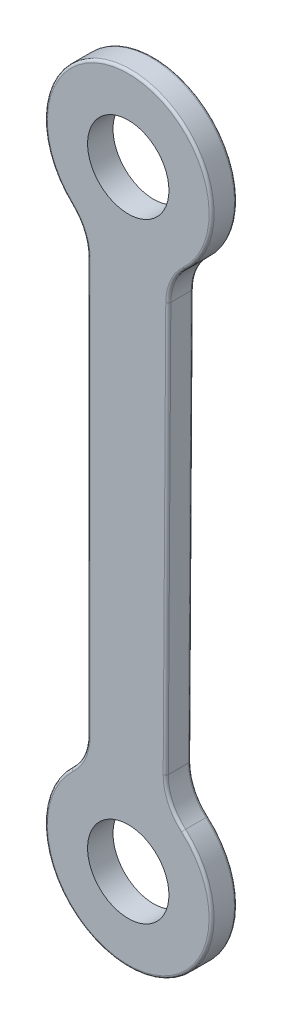
ISO-10303-21;
HEADER;
FILE_DESCRIPTION(('STEP AP214'),'2;1');
FILE_NAME('part.step','',(''),(''),'','','');
FILE_SCHEMA(('AUTOMOTIVE_DESIGN { 1 0 10303 214 1 1 1 1 }'));
ENDSEC;
DATA;
#1=APPLICATION_CONTEXT('core data for automotive mechanical design processes');
#2=APPLICATION_PROTOCOL_DEFINITION('international standard','automotive_design',2000,#1);
#3=PRODUCT_CONTEXT('',#1,'mechanical');
#4=PRODUCT('Part','Part','',(#3));
#5=PRODUCT_RELATED_PRODUCT_CATEGORY('part','',(#4));
#6=PRODUCT_DEFINITION_FORMATION('','',#4);
#7=PRODUCT_DEFINITION_CONTEXT('part definition',#1,'design');
#8=PRODUCT_DEFINITION('design','',#6,#7);
#9=PRODUCT_DEFINITION_SHAPE('','',#8);
#10=(LENGTH_UNIT() NAMED_UNIT(*) SI_UNIT(.MILLI.,.METRE.));
#11=(NAMED_UNIT(*) PLANE_ANGLE_UNIT() SI_UNIT($,.RADIAN.));
#12=(NAMED_UNIT(*) SI_UNIT($,.STERADIAN.) SOLID_ANGLE_UNIT());
#13=UNCERTAINTY_MEASURE_WITH_UNIT(LENGTH_MEASURE(1.E-05),#10,'distance_accuracy_value','');
#14=(GEOMETRIC_REPRESENTATION_CONTEXT(3) GLOBAL_UNCERTAINTY_ASSIGNED_CONTEXT((#13)) GLOBAL_UNIT_ASSIGNED_CONTEXT((#10,
#11,#12)) REPRESENTATION_CONTEXT('',''));
#15=CARTESIAN_POINT('',(0.,0.,0.));
#16=DIRECTION('',(0.,0.,1.));
#17=DIRECTION('',(1.,0.,0.));
#18=AXIS2_PLACEMENT_3D('',#15,#16,#17);
#19=CARTESIAN_POINT('',(-18.,100.694497558709,5.));
#20=DIRECTION('',(0.,0.,1.));
#21=DIRECTION('',(1.,0.,0.));
#22=AXIS2_PLACEMENT_3D('',#19,#20,#21);
#23=PLANE('',#22);
#24=CARTESIAN_POINT('',(17.3653896066539,19.8782712608472,5.));
#25=DIRECTION('',(0.,0.,1.));
#26=DIRECTION('',(1.,0.,0.));
#27=AXIS2_PLACEMENT_3D('',#24,#25,#26);
#28=CIRCLE('',#27,10.5);
#29=CARTESIAN_POINT('',(10.4574239522485,11.9706793064306,5.));
#30=VERTEX_POINT('',#29);
#31=CARTESIAN_POINT('',(6.8656007605948,19.9448609610506,5.));
#32=VERTEX_POINT('',#31);
#33=EDGE_CURVE('E62',#30,#32,#28,.F.);
#34=ORIENTED_EDGE('',*,*,#33,.T.);
#35=DIRECTION('',(0.00634187620984643,0.999979890100866,0.));
#36=VECTOR('',#35,1.);
#37=CARTESIAN_POINT('',(7.37741606910492,100.647321718842,5.));
#38=LINE('',#37,#36);
#39=CARTESIAN_POINT('',(7.37741606910493,100.647321718842,5.));
#40=VERTEX_POINT('',#39);
#41=EDGE_CURVE('E164',#32,#40,#38,.T.);
#42=ORIENTED_EDGE('',*,*,#41,.T.);
#43=CARTESIAN_POINT('',(17.877204915164,100.580732018638,5.));
#44=DIRECTION('',(0.,0.,1.));
#45=DIRECTION('',(1.,0.,0.));
#46=AXIS2_PLACEMENT_3D('',#43,#44,#45);
#47=CIRCLE('',#46,10.5);
#48=CARTESIAN_POINT('',(10.7656387281663,108.305732107179,5.));
#49=VERTEX_POINT('',#48);
#50=EDGE_CURVE('E279',#40,#49,#47,.F.);
#51=ORIENTED_EDGE('',*,*,#50,.T.);
#52=CARTESIAN_POINT('',(0.,120.,5.));
#53=DIRECTION('',(0.,0.,1.));
#54=DIRECTION('',(1.,0.,0.));
#55=AXIS2_PLACEMENT_3D('',#52,#53,#54);
#56=CIRCLE('',#55,15.8951212255354);
#57=CARTESIAN_POINT('',(-10.8395858315984,108.37424162586,5.));
#58=VERTEX_POINT('',#57);
#59=EDGE_CURVE('E276',#49,#58,#56,.T.);
#60=ORIENTED_EDGE('',*,*,#59,.T.);
#61=CARTESIAN_POINT('',(-18.,100.694497558709,5.));
#62=DIRECTION('',(0.,0.,1.));
#63=DIRECTION('',(1.,0.,0.));
#64=AXIS2_PLACEMENT_3D('',#61,#62,#63);
#65=CIRCLE('',#64,10.5);
#66=CARTESIAN_POINT('',(-7.5,100.694497558709,5.));
#67=VERTEX_POINT('',#66);
#68=EDGE_CURVE('E282',#58,#67,#65,.F.);
#69=ORIENTED_EDGE('',*,*,#68,.T.);
#70=DIRECTION('',(0.,-1.,0.));
#71=VECTOR('',#70,1.);
#72=CARTESIAN_POINT('',(-7.5,19.3055024412914,5.));
#73=LINE('',#72,#71);
#74=CARTESIAN_POINT('',(-7.5,19.3055024412914,5.));
#75=VERTEX_POINT('',#74);
#76=EDGE_CURVE('E285',#67,#75,#73,.T.);
#77=ORIENTED_EDGE('',*,*,#76,.T.);
#78=CARTESIAN_POINT('',(-18.,19.3055024412914,5.));
#79=DIRECTION('',(0.,0.,1.));
#80=DIRECTION('',(1.,0.,0.));
#81=AXIS2_PLACEMENT_3D('',#78,#79,#80);
#82=CIRCLE('',#81,10.5);
#83=CARTESIAN_POINT('',(-10.8395858315984,11.6257583741395,5.));
#84=VERTEX_POINT('',#83);
#85=EDGE_CURVE('E288',#75,#84,#82,.F.);
#86=ORIENTED_EDGE('',*,*,#85,.T.);
#87=CARTESIAN_POINT('',(0.,0.,5.));
#88=DIRECTION('',(0.,0.,1.));
#89=DIRECTION('',(1.,0.,0.));
#90=AXIS2_PLACEMENT_3D('',#87,#88,#89);
#91=CIRCLE('',#90,15.8951212255354);
#92=EDGE_CURVE('E67',#84,#30,#91,.T.);
#93=ORIENTED_EDGE('',*,*,#92,.T.);
#94=EDGE_LOOP('',(#34,#42,#51,#60,#69,#77,#86,#93));
#95=FACE_BOUND('',#94,.T.);
#96=CARTESIAN_POINT('',(0.,120.,5.));
#97=DIRECTION('',(0.,0.,1.));
#98=DIRECTION('',(1.,0.,0.));
#99=AXIS2_PLACEMENT_3D('',#96,#97,#98);
#100=CIRCLE('',#99,8.00000000000001);
#101=CARTESIAN_POINT('',(8.00000000000001,120.,5.));
#102=VERTEX_POINT('',#101);
#103=EDGE_CURVE('E663',#102,#102,#100,.T.);
#104=ORIENTED_EDGE('',*,*,#103,.F.);
#105=EDGE_LOOP('',(#104));
#106=FACE_BOUND('',#105,.T.);
#107=CARTESIAN_POINT('',(0.,0.,5.));
#108=DIRECTION('',(0.,0.,1.));
#109=DIRECTION('',(1.,0.,0.));
#110=AXIS2_PLACEMENT_3D('',#107,#108,#109);
#111=CIRCLE('',#110,8.);
#112=CARTESIAN_POINT('',(8.,0.,5.));
#113=VERTEX_POINT('',#112);
#114=EDGE_CURVE('E668',#113,#113,#111,.T.);
#115=ORIENTED_EDGE('',*,*,#114,.F.);
#116=EDGE_LOOP('',(#115));
#117=FACE_BOUND('',#116,.T.);
#118=ADVANCED_FACE('F44',(#95,#106,#117),#23,.T.);
#119=CARTESIAN_POINT('',(-18.,100.694497558709,0.));
#120=DIRECTION('',(0.,0.,1.));
#121=DIRECTION('',(1.,0.,0.));
#122=AXIS2_PLACEMENT_3D('',#119,#120,#121);
#123=PLANE('',#122);
#124=DIRECTION('',(0.00634187620984643,0.999979890100866,0.));
#125=VECTOR('',#124,1.);
#126=CARTESIAN_POINT('',(7.37669458213285,100.533558466585,0.));
#127=LINE('',#126,#125);
#128=CARTESIAN_POINT('',(7.37741606910493,100.647321718842,0.));
#129=VERTEX_POINT('',#128);
#130=CARTESIAN_POINT('',(6.8656007605948,19.9448609610506,0.));
#131=VERTEX_POINT('',#130);
#132=EDGE_CURVE('E215',#129,#131,#127,.F.);
#133=ORIENTED_EDGE('',*,*,#132,.T.);
#134=CARTESIAN_POINT('',(17.3653896066539,19.8782712608472,0.));
#135=DIRECTION('',(0.,0.,1.));
#136=DIRECTION('',(1.,0.,0.));
#137=AXIS2_PLACEMENT_3D('',#134,#135,#136);
#138=CIRCLE('',#137,10.5);
#139=CARTESIAN_POINT('',(10.4574239522485,11.9706793064306,0.));
#140=VERTEX_POINT('',#139);
#141=EDGE_CURVE('E236',#131,#140,#138,.T.);
#142=ORIENTED_EDGE('',*,*,#141,.T.);
#143=CARTESIAN_POINT('',(0.,0.,0.));
#144=DIRECTION('',(0.,0.,1.));
#145=DIRECTION('',(1.,0.,0.));
#146=AXIS2_PLACEMENT_3D('',#143,#144,#145);
#147=CIRCLE('',#146,15.8951212255354);
#148=CARTESIAN_POINT('',(-10.8395858315984,11.6257583741395,0.));
#149=VERTEX_POINT('',#148);
#150=EDGE_CURVE('E233',#140,#149,#147,.F.);
#151=ORIENTED_EDGE('',*,*,#150,.T.);
#152=CARTESIAN_POINT('',(-18.,19.3055024412914,0.));
#153=DIRECTION('',(0.,0.,1.));
#154=DIRECTION('',(1.,0.,0.));
#155=AXIS2_PLACEMENT_3D('',#152,#153,#154);
#156=CIRCLE('',#155,10.5);
#157=CARTESIAN_POINT('',(-7.5,19.3055024412914,0.));
#158=VERTEX_POINT('',#157);
#159=EDGE_CURVE('E230',#149,#158,#156,.T.);
#160=ORIENTED_EDGE('',*,*,#159,.T.);
#161=DIRECTION('',(0.,-1.,0.));
#162=VECTOR('',#161,1.);
#163=CARTESIAN_POINT('',(-7.5,100.694497558709,0.));
#164=LINE('',#163,#162);
#165=CARTESIAN_POINT('',(-7.5,100.694497558709,0.));
#166=VERTEX_POINT('',#165);
#167=EDGE_CURVE('E227',#158,#166,#164,.F.);
#168=ORIENTED_EDGE('',*,*,#167,.T.);
#169=CARTESIAN_POINT('',(-18.,100.694497558709,0.));
#170=DIRECTION('',(0.,0.,1.));
#171=DIRECTION('',(1.,0.,0.));
#172=AXIS2_PLACEMENT_3D('',#169,#170,#171);
#173=CIRCLE('',#172,10.5);
#174=CARTESIAN_POINT('',(-10.8395858315984,108.37424162586,0.));
#175=VERTEX_POINT('',#174);
#176=EDGE_CURVE('E224',#166,#175,#173,.T.);
#177=ORIENTED_EDGE('',*,*,#176,.T.);
#178=CARTESIAN_POINT('',(0.,120.,0.));
#179=DIRECTION('',(0.,0.,1.));
#180=DIRECTION('',(1.,0.,0.));
#181=AXIS2_PLACEMENT_3D('',#178,#179,#180);
#182=CIRCLE('',#181,15.8951212255354);
#183=CARTESIAN_POINT('',(10.7656387281663,108.305732107179,0.));
#184=VERTEX_POINT('',#183);
#185=EDGE_CURVE('E221',#175,#184,#182,.F.);
#186=ORIENTED_EDGE('',*,*,#185,.T.);
#187=CARTESIAN_POINT('',(17.877204915164,100.580732018638,0.));
#188=DIRECTION('',(0.,0.,1.));
#189=DIRECTION('',(1.,0.,0.));
#190=AXIS2_PLACEMENT_3D('',#187,#188,#189);
#191=CIRCLE('',#190,10.5);
#192=EDGE_CURVE('E218',#184,#129,#191,.T.);
#193=ORIENTED_EDGE('',*,*,#192,.T.);
#194=EDGE_LOOP('',(#133,#142,#151,#160,#168,#177,#186,#193));
#195=FACE_BOUND('',#194,.T.);
#196=CARTESIAN_POINT('',(0.,120.,0.));
#197=DIRECTION('',(0.,0.,1.));
#198=DIRECTION('',(1.,0.,0.));
#199=AXIS2_PLACEMENT_3D('',#196,#197,#198);
#200=CIRCLE('',#199,8.00000000000001);
#201=CARTESIAN_POINT('',(8.00000000000001,120.,0.));
#202=VERTEX_POINT('',#201);
#203=EDGE_CURVE('E666',#202,#202,#200,.T.);
#204=ORIENTED_EDGE('',*,*,#203,.T.);
#205=EDGE_LOOP('',(#204));
#206=FACE_BOUND('',#205,.T.);
#207=CARTESIAN_POINT('',(0.,0.,0.));
#208=DIRECTION('',(0.,0.,1.));
#209=DIRECTION('',(1.,0.,0.));
#210=AXIS2_PLACEMENT_3D('',#207,#208,#209);
#211=CIRCLE('',#210,8.);
#212=CARTESIAN_POINT('',(8.,0.,0.));
#213=VERTEX_POINT('',#212);
#214=EDGE_CURVE('E329',#213,#213,#211,.T.);
#215=ORIENTED_EDGE('',*,*,#214,.T.);
#216=EDGE_LOOP('',(#215));
#217=FACE_BOUND('',#216,.T.);
#218=ADVANCED_FACE('F385',(#195,#206,#217),#123,.F.);
#219=CARTESIAN_POINT('',(-18.,100.694497558709,5.));
#220=DIRECTION('',(0.,0.,-1.));
#221=DIRECTION('',(-1.,0.,0.));
#222=AXIS2_PLACEMENT_3D('',#219,#220,#221);
#223=CYLINDRICAL_SURFACE('',#222,10.);
#224=DIRECTION('',(0.,0.,-1.));
#225=VECTOR('',#224,1.);
#226=CARTESIAN_POINT('',(-11.1805579348557,108.008539527425,5.));
#227=LINE('',#226,#225);
#228=CARTESIAN_POINT('',(-11.1805579348557,108.008539527425,4.5));
#229=VERTEX_POINT('',#228);
#230=CARTESIAN_POINT('',(-11.1805579348557,108.008539527425,0.5));
#231=VERTEX_POINT('',#230);
#232=EDGE_CURVE('E372',#229,#231,#227,.T.);
#233=ORIENTED_EDGE('',*,*,#232,.T.);
#234=CARTESIAN_POINT('',(-18.,100.694497558709,0.5));
#235=DIRECTION('',(0.,0.,1.));
#236=DIRECTION('',(1.,0.,0.));
#237=AXIS2_PLACEMENT_3D('',#234,#235,#236);
#238=CIRCLE('',#237,10.);
#239=CARTESIAN_POINT('',(-8.,100.694497558709,0.5));
#240=VERTEX_POINT('',#239);
#241=EDGE_CURVE('E261',#231,#240,#238,.F.);
#242=ORIENTED_EDGE('',*,*,#241,.T.);
#243=DIRECTION('',(0.,0.,-1.));
#244=VECTOR('',#243,1.);
#245=CARTESIAN_POINT('',(-8.,100.694497558709,5.));
#246=LINE('',#245,#244);
#247=CARTESIAN_POINT('',(-8.,100.694497558709,4.5));
#248=VERTEX_POINT('',#247);
#249=EDGE_CURVE('E180',#248,#240,#246,.T.);
#250=ORIENTED_EDGE('',*,*,#249,.F.);
#251=CARTESIAN_POINT('',(-18.,100.694497558709,4.5));
#252=DIRECTION('',(0.,0.,1.));
#253=DIRECTION('',(1.,0.,0.));
#254=AXIS2_PLACEMENT_3D('',#251,#252,#253);
#255=CIRCLE('',#254,10.);
#256=EDGE_CURVE('E258',#248,#229,#255,.T.);
#257=ORIENTED_EDGE('',*,*,#256,.T.);
#258=EDGE_LOOP('',(#233,#242,#250,#257));
#259=FACE_BOUND('',#258,.T.);
#260=ADVANCED_FACE('F369',(#259),#223,.F.);
#261=CARTESIAN_POINT('',(-8.,19.3055024412914,5.));
#262=DIRECTION('',(1.,0.,0.));
#263=DIRECTION('',(0.,0.,-1.));
#264=AXIS2_PLACEMENT_3D('',#261,#262,#263);
#265=PLANE('',#264);
#266=ORIENTED_EDGE('',*,*,#249,.T.);
#267=DIRECTION('',(0.,-1.,0.));
#268=VECTOR('',#267,1.);
#269=CARTESIAN_POINT('',(-8.,19.3055024412914,0.5));
#270=LINE('',#269,#268);
#271=CARTESIAN_POINT('',(-8.,19.3055024412914,0.5));
#272=VERTEX_POINT('',#271);
#273=EDGE_CURVE('E255',#240,#272,#270,.T.);
#274=ORIENTED_EDGE('',*,*,#273,.T.);
#275=DIRECTION('',(0.,0.,-1.));
#276=VECTOR('',#275,1.);
#277=CARTESIAN_POINT('',(-8.,19.3055024412914,5.));
#278=LINE('',#277,#276);
#279=CARTESIAN_POINT('',(-8.,19.3055024412914,4.5));
#280=VERTEX_POINT('',#279);
#281=EDGE_CURVE('E206',#280,#272,#278,.T.);
#282=ORIENTED_EDGE('',*,*,#281,.F.);
#283=DIRECTION('',(0.,-1.,0.));
#284=VECTOR('',#283,1.);
#285=CARTESIAN_POINT('',(-8.,100.694497558709,4.5));
#286=LINE('',#285,#284);
#287=EDGE_CURVE('E252',#280,#248,#286,.F.);
#288=ORIENTED_EDGE('',*,*,#287,.T.);
#289=EDGE_LOOP('',(#266,#274,#282,#288));
#290=FACE_BOUND('',#289,.T.);
#291=ADVANCED_FACE('F365',(#290),#265,.F.);
#292=CARTESIAN_POINT('',(-18.,19.3055024412914,5.));
#293=DIRECTION('',(0.,0.,-1.));
#294=DIRECTION('',(-1.,0.,0.));
#295=AXIS2_PLACEMENT_3D('',#292,#293,#294);
#296=CYLINDRICAL_SURFACE('',#295,10.);
#297=ORIENTED_EDGE('',*,*,#281,.T.);
#298=CARTESIAN_POINT('',(-18.,19.3055024412914,0.5));
#299=DIRECTION('',(0.,0.,1.));
#300=DIRECTION('',(1.,0.,0.));
#301=AXIS2_PLACEMENT_3D('',#298,#299,#300);
#302=CIRCLE('',#301,10.);
#303=CARTESIAN_POINT('',(-11.1805579348557,11.9914604725753,0.5));
#304=VERTEX_POINT('',#303);
#305=EDGE_CURVE('E249',#272,#304,#302,.F.);
#306=ORIENTED_EDGE('',*,*,#305,.T.);
#307=DIRECTION('',(0.,0.,-1.));
#308=VECTOR('',#307,1.);
#309=CARTESIAN_POINT('',(-11.1805579348557,11.9914604725753,5.));
#310=LINE('',#309,#308);
#311=CARTESIAN_POINT('',(-11.1805579348557,11.9914604725753,4.5));
#312=VERTEX_POINT('',#311);
#313=EDGE_CURVE('E197',#312,#304,#310,.T.);
#314=ORIENTED_EDGE('',*,*,#313,.F.);
#315=CARTESIAN_POINT('',(-18.,19.3055024412914,4.5));
#316=DIRECTION('',(0.,0.,1.));
#317=DIRECTION('',(1.,0.,0.));
#318=AXIS2_PLACEMENT_3D('',#315,#316,#317);
#319=CIRCLE('',#318,10.);
#320=EDGE_CURVE('E246',#312,#280,#319,.T.);
#321=ORIENTED_EDGE('',*,*,#320,.T.);
#322=EDGE_LOOP('',(#297,#306,#314,#321));
#323=FACE_BOUND('',#322,.T.);
#324=ADVANCED_FACE('F394',(#323),#296,.F.);
#325=CARTESIAN_POINT('',(0.,0.,5.));
#326=DIRECTION('',(0.,0.,-1.));
#327=DIRECTION('',(-1.,0.,0.));
#328=AXIS2_PLACEMENT_3D('',#325,#326,#327);
#329=CYLINDRICAL_SURFACE('',#328,16.3951212255354);
#330=ORIENTED_EDGE('',*,*,#313,.T.);
#331=CARTESIAN_POINT('',(0.,0.,0.5));
#332=DIRECTION('',(0.,0.,1.));
#333=DIRECTION('',(1.,0.,0.));
#334=AXIS2_PLACEMENT_3D('',#331,#332,#333);
#335=CIRCLE('',#334,16.3951212255354);
#336=CARTESIAN_POINT('',(10.7863746976963,12.3472313042599,0.5));
#337=VERTEX_POINT('',#336);
#338=EDGE_CURVE('E243',#304,#337,#335,.T.);
#339=ORIENTED_EDGE('',*,*,#338,.T.);
#340=DIRECTION('',(0.,0.,-1.));
#341=VECTOR('',#340,1.);
#342=CARTESIAN_POINT('',(10.7863746976963,12.3472313042599,5.));
#343=LINE('',#342,#341);
#344=CARTESIAN_POINT('',(10.7863746976963,12.3472313042599,4.5));
#345=VERTEX_POINT('',#344);
#346=EDGE_CURVE('E193',#345,#337,#343,.T.);
#347=ORIENTED_EDGE('',*,*,#346,.F.);
#348=CARTESIAN_POINT('',(0.,0.,4.5));
#349=DIRECTION('',(0.,0.,1.));
#350=DIRECTION('',(1.,0.,0.));
#351=AXIS2_PLACEMENT_3D('',#348,#349,#350);
#352=CIRCLE('',#351,16.3951212255354);
#353=EDGE_CURVE('E240',#345,#312,#352,.F.);
#354=ORIENTED_EDGE('',*,*,#353,.T.);
#355=EDGE_LOOP('',(#330,#339,#347,#354));
#356=FACE_BOUND('',#355,.T.);
#357=ADVANCED_FACE('F398',(#356),#329,.T.);
#358=CARTESIAN_POINT('',(17.3653896066539,19.8782712608472,5.));
#359=DIRECTION('',(0.,0.,-1.));
#360=DIRECTION('',(-1.,0.,0.));
#361=AXIS2_PLACEMENT_3D('',#358,#359,#360);
#362=CYLINDRICAL_SURFACE('',#361,10.);
#363=ORIENTED_EDGE('',*,*,#346,.T.);
#364=CARTESIAN_POINT('',(17.3653896066539,19.8782712608472,0.5));
#365=DIRECTION('',(0.,0.,1.));
#366=DIRECTION('',(1.,0.,0.));
#367=AXIS2_PLACEMENT_3D('',#364,#365,#366);
#368=CIRCLE('',#367,10.);
#369=CARTESIAN_POINT('',(7.36559070564523,19.9416900229457,0.5));
#370=VERTEX_POINT('',#369);
#371=EDGE_CURVE('E179',#337,#370,#368,.F.);
#372=ORIENTED_EDGE('',*,*,#371,.T.);
#373=DIRECTION('',(0.,0.,-1.));
#374=VECTOR('',#373,1.);
#375=CARTESIAN_POINT('',(7.36559070564523,19.9416900229457,5.));
#376=LINE('',#375,#374);
#377=CARTESIAN_POINT('',(7.36559070564523,19.9416900229457,4.5));
#378=VERTEX_POINT('',#377);
#379=EDGE_CURVE('E186',#378,#370,#376,.T.);
#380=ORIENTED_EDGE('',*,*,#379,.F.);
#381=CARTESIAN_POINT('',(17.3653896066539,19.8782712608472,4.5));
#382=DIRECTION('',(0.,0.,1.));
#383=DIRECTION('',(1.,0.,0.));
#384=AXIS2_PLACEMENT_3D('',#381,#382,#383);
#385=CIRCLE('',#384,10.);
#386=EDGE_CURVE('E171',#378,#345,#385,.T.);
#387=ORIENTED_EDGE('',*,*,#386,.T.);
#388=EDGE_LOOP('',(#363,#372,#380,#387));
#389=FACE_BOUND('',#388,.T.);
#390=ADVANCED_FACE('F190',(#389),#362,.F.);
#391=CARTESIAN_POINT('',(7.36559070564523,19.9416900229457,5.));
#392=DIRECTION('',(-0.999979890100866,0.00634187620984643,0.));
#393=DIRECTION('',(-0.00634187620984643,-0.999979890100866,0.));
#394=AXIS2_PLACEMENT_3D('',#391,#392,#393);
#395=PLANE('',#394);
#396=DIRECTION('',(0.,0.,-1.));
#397=VECTOR('',#396,1.);
#398=CARTESIAN_POINT('',(7.87740601415536,100.644150780737,5.));
#399=LINE('',#398,#397);
#400=CARTESIAN_POINT('',(7.87740601415536,100.644150780737,4.5));
#401=VERTEX_POINT('',#400);
#402=CARTESIAN_POINT('',(7.87740601415536,100.644150780737,0.5));
#403=VERTEX_POINT('',#402);
#404=EDGE_CURVE('E188',#401,#403,#399,.T.);
#405=ORIENTED_EDGE('',*,*,#404,.F.);
#406=DIRECTION('',(0.00634187620984643,0.999979890100866,0.));
#407=VECTOR('',#406,1.);
#408=CARTESIAN_POINT('',(7.36559070564523,19.9416900229457,4.5));
#409=LINE('',#408,#407);
#410=EDGE_CURVE('E11',#401,#378,#409,.F.);
#411=ORIENTED_EDGE('',*,*,#410,.T.);
#412=ORIENTED_EDGE('',*,*,#379,.T.);
#413=DIRECTION('',(0.00634187620984643,0.999979890100866,0.));
#414=VECTOR('',#413,1.);
#415=CARTESIAN_POINT('',(7.36559070564523,19.9416900229457,0.5));
#416=LINE('',#415,#414);
#417=EDGE_CURVE('E54',#370,#403,#416,.T.);
#418=ORIENTED_EDGE('',*,*,#417,.T.);
#419=EDGE_LOOP('',(#405,#411,#412,#418));
#420=FACE_BOUND('',#419,.T.);
#421=ADVANCED_FACE('F185',(#420),#395,.F.);
#422=CARTESIAN_POINT('',(17.877204915164,100.580732018638,5.));
#423=DIRECTION('',(0.,0.,-1.));
#424=DIRECTION('',(-1.,0.,0.));
#425=AXIS2_PLACEMENT_3D('',#422,#423,#424);
#426=CYLINDRICAL_SURFACE('',#425,10.);
#427=ORIENTED_EDGE('',*,*,#404,.T.);
#428=CARTESIAN_POINT('',(17.877204915164,100.580732018638,0.5));
#429=DIRECTION('',(0.,0.,1.));
#430=DIRECTION('',(1.,0.,0.));
#431=AXIS2_PLACEMENT_3D('',#428,#429,#430);
#432=CIRCLE('',#431,10.);
#433=CARTESIAN_POINT('',(11.104284737071,107.937874960105,0.5));
#434=VERTEX_POINT('',#433);
#435=EDGE_CURVE('E273',#403,#434,#432,.F.);
#436=ORIENTED_EDGE('',*,*,#435,.T.);
#437=DIRECTION('',(0.,0.,-1.));
#438=VECTOR('',#437,1.);
#439=CARTESIAN_POINT('',(11.104284737071,107.937874960105,5.));
#440=LINE('',#439,#438);
#441=CARTESIAN_POINT('',(11.104284737071,107.937874960105,4.5));
#442=VERTEX_POINT('',#441);
#443=EDGE_CURVE('E199',#442,#434,#440,.T.);
#444=ORIENTED_EDGE('',*,*,#443,.F.);
#445=CARTESIAN_POINT('',(17.877204915164,100.580732018638,4.5));
#446=DIRECTION('',(0.,0.,1.));
#447=DIRECTION('',(1.,0.,0.));
#448=AXIS2_PLACEMENT_3D('',#445,#446,#447);
#449=CIRCLE('',#448,10.);
#450=EDGE_CURVE('E270',#442,#401,#449,.T.);
#451=ORIENTED_EDGE('',*,*,#450,.T.);
#452=EDGE_LOOP('',(#427,#436,#444,#451));
#453=FACE_BOUND('',#452,.T.);
#454=ADVANCED_FACE('F418',(#453),#426,.F.);
#455=CARTESIAN_POINT('',(0.,120.,5.));
#456=DIRECTION('',(0.,0.,-1.));
#457=DIRECTION('',(-1.,0.,0.));
#458=AXIS2_PLACEMENT_3D('',#455,#456,#457);
#459=CYLINDRICAL_SURFACE('',#458,16.3951212255354);
#460=ORIENTED_EDGE('',*,*,#443,.T.);
#461=CARTESIAN_POINT('',(0.,120.,0.5));
#462=DIRECTION('',(0.,0.,1.));
#463=DIRECTION('',(1.,0.,0.));
#464=AXIS2_PLACEMENT_3D('',#461,#462,#463);
#465=CIRCLE('',#464,16.3951212255354);
#466=EDGE_CURVE('E267',#434,#231,#465,.T.);
#467=ORIENTED_EDGE('',*,*,#466,.T.);
#468=ORIENTED_EDGE('',*,*,#232,.F.);
#469=CARTESIAN_POINT('',(0.,120.,4.5));
#470=DIRECTION('',(0.,0.,1.));
#471=DIRECTION('',(1.,0.,0.));
#472=AXIS2_PLACEMENT_3D('',#469,#470,#471);
#473=CIRCLE('',#472,16.3951212255354);
#474=EDGE_CURVE('E264',#229,#442,#473,.F.);
#475=ORIENTED_EDGE('',*,*,#474,.T.);
#476=EDGE_LOOP('',(#460,#467,#468,#475));
#477=FACE_BOUND('',#476,.T.);
#478=ADVANCED_FACE('F444',(#477),#459,.T.);
#479=CARTESIAN_POINT('',(0.,120.,5.));
#480=DIRECTION('',(0.,0.,-1.));
#481=DIRECTION('',(-1.,0.,0.));
#482=AXIS2_PLACEMENT_3D('',#479,#480,#481);
#483=CYLINDRICAL_SURFACE('',#482,8.00000000000001);
#484=ORIENTED_EDGE('',*,*,#103,.T.);
#485=EDGE_LOOP('',(#484));
#486=FACE_BOUND('',#485,.T.);
#487=ORIENTED_EDGE('',*,*,#203,.F.);
#488=EDGE_LOOP('',(#487));
#489=FACE_BOUND('',#488,.T.);
#490=ADVANCED_FACE('F441',(#486,#489),#483,.F.);
#491=CARTESIAN_POINT('',(0.,0.,5.));
#492=DIRECTION('',(0.,0.,-1.));
#493=DIRECTION('',(-1.,0.,0.));
#494=AXIS2_PLACEMENT_3D('',#491,#492,#493);
#495=CYLINDRICAL_SURFACE('',#494,8.);
#496=ORIENTED_EDGE('',*,*,#114,.T.);
#497=EDGE_LOOP('',(#496));
#498=FACE_BOUND('',#497,.T.);
#499=ORIENTED_EDGE('',*,*,#214,.F.);
#500=EDGE_LOOP('',(#499));
#501=FACE_BOUND('',#500,.T.);
#502=ADVANCED_FACE('F580',(#498,#501),#495,.F.);
#503=CARTESIAN_POINT('',(-18.,100.694497558709,0.5));
#504=DIRECTION('',(0.,0.,1.));
#505=DIRECTION('',(1.,0.,0.));
#506=AXIS2_PLACEMENT_3D('',#503,#504,#505);
#507=TOROIDAL_SURFACE('',#506,10.5,0.5);
#508=CARTESIAN_POINT('',(-10.8395858315984,108.37424162586,0.5));
#509=DIRECTION('',(-0.7314041968716,0.681944206514441,0.));
#510=DIRECTION('',(-0.681944206514441,-0.7314041968716,0.));
#511=AXIS2_PLACEMENT_3D('',#508,#509,#510);
#512=CIRCLE('',#511,0.5);
#513=EDGE_CURVE('E321',#175,#231,#512,.T.);
#514=ORIENTED_EDGE('',*,*,#513,.F.);
#515=ORIENTED_EDGE('',*,*,#176,.F.);
#516=CARTESIAN_POINT('',(-7.5,100.694497558709,0.5));
#517=DIRECTION('',(0.,-1.,0.));
#518=DIRECTION('',(0.,0.,-1.));
#519=AXIS2_PLACEMENT_3D('',#516,#517,#518);
#520=CIRCLE('',#519,0.5);
#521=EDGE_CURVE('E325',#240,#166,#520,.T.);
#522=ORIENTED_EDGE('',*,*,#521,.F.);
#523=ORIENTED_EDGE('',*,*,#241,.F.);
#524=EDGE_LOOP('',(#514,#515,#522,#523));
#525=FACE_BOUND('',#524,.T.);
#526=ADVANCED_FACE('F375',(#525),#507,.T.);
#527=CARTESIAN_POINT('',(-7.5,19.3055024412914,0.5));
#528=DIRECTION('',(0.,-1.,0.));
#529=DIRECTION('',(0.,0.,-1.));
#530=AXIS2_PLACEMENT_3D('',#527,#528,#529);
#531=CYLINDRICAL_SURFACE('',#530,0.5);
#532=ORIENTED_EDGE('',*,*,#521,.T.);
#533=ORIENTED_EDGE('',*,*,#167,.F.);
#534=CARTESIAN_POINT('',(-7.5,19.3055024412914,0.5));
#535=DIRECTION('',(0.,-1.,0.));
#536=DIRECTION('',(0.,0.,-1.));
#537=AXIS2_PLACEMENT_3D('',#534,#535,#536);
#538=CIRCLE('',#537,0.5);
#539=EDGE_CURVE('E317',#272,#158,#538,.T.);
#540=ORIENTED_EDGE('',*,*,#539,.F.);
#541=ORIENTED_EDGE('',*,*,#273,.F.);
#542=EDGE_LOOP('',(#532,#533,#540,#541));
#543=FACE_BOUND('',#542,.T.);
#544=ADVANCED_FACE('F390',(#543),#531,.T.);
#545=CARTESIAN_POINT('',(0.,120.,0.5));
#546=DIRECTION('',(0.,0.,1.));
#547=DIRECTION('',(1.,0.,0.));
#548=AXIS2_PLACEMENT_3D('',#545,#546,#547);
#549=TOROIDAL_SURFACE('',#548,15.8951212255354,0.5);
#550=ORIENTED_EDGE('',*,*,#513,.T.);
#551=ORIENTED_EDGE('',*,*,#466,.F.);
#552=CARTESIAN_POINT('',(10.7656387281663,108.305732107179,0.5));
#553=DIRECTION('',(-0.735714294146713,-0.677292017809309,0.));
#554=DIRECTION('',(0.677292017809309,-0.735714294146713,0.));
#555=AXIS2_PLACEMENT_3D('',#552,#553,#554);
#556=CIRCLE('',#555,0.5);
#557=EDGE_CURVE('E313',#184,#434,#556,.T.);
#558=ORIENTED_EDGE('',*,*,#557,.F.);
#559=ORIENTED_EDGE('',*,*,#185,.F.);
#560=EDGE_LOOP('',(#550,#551,#558,#559));
#561=FACE_BOUND('',#560,.T.);
#562=ADVANCED_FACE('F381',(#561),#549,.T.);
#563=CARTESIAN_POINT('',(-18.,19.3055024412914,0.5));
#564=DIRECTION('',(0.,0.,1.));
#565=DIRECTION('',(1.,0.,0.));
#566=AXIS2_PLACEMENT_3D('',#563,#564,#565);
#567=TOROIDAL_SURFACE('',#566,10.5,0.5);
#568=ORIENTED_EDGE('',*,*,#539,.T.);
#569=ORIENTED_EDGE('',*,*,#159,.F.);
#570=CARTESIAN_POINT('',(-10.8395858315984,11.6257583741395,0.5));
#571=DIRECTION('',(-0.731404196871607,-0.681944206514434,0.));
#572=DIRECTION('',(0.681944206514434,-0.731404196871607,0.));
#573=AXIS2_PLACEMENT_3D('',#570,#571,#572);
#574=CIRCLE('',#573,0.5);
#575=EDGE_CURVE('E309',#304,#149,#574,.T.);
#576=ORIENTED_EDGE('',*,*,#575,.F.);
#577=ORIENTED_EDGE('',*,*,#305,.F.);
#578=EDGE_LOOP('',(#568,#569,#576,#577));
#579=FACE_BOUND('',#578,.T.);
#580=ADVANCED_FACE('F403',(#579),#567,.T.);
#581=CARTESIAN_POINT('',(17.877204915164,100.580732018638,0.5));
#582=DIRECTION('',(0.,0.,1.));
#583=DIRECTION('',(1.,0.,0.));
#584=AXIS2_PLACEMENT_3D('',#581,#582,#583);
#585=TOROIDAL_SURFACE('',#584,10.5,0.5);
#586=ORIENTED_EDGE('',*,*,#557,.T.);
#587=ORIENTED_EDGE('',*,*,#435,.F.);
#588=CARTESIAN_POINT('',(7.37741606910493,100.647321718842,0.5));
#589=DIRECTION('',(-0.00634187620984769,-0.999979890100865,0.));
#590=DIRECTION('',(0.999979890100866,-0.00634187620984769,0.));
#591=AXIS2_PLACEMENT_3D('',#588,#589,#590);
#592=CIRCLE('',#591,0.5);
#593=EDGE_CURVE('E305',#129,#403,#592,.T.);
#594=ORIENTED_EDGE('',*,*,#593,.F.);
#595=ORIENTED_EDGE('',*,*,#192,.F.);
#596=EDGE_LOOP('',(#586,#587,#594,#595));
#597=FACE_BOUND('',#596,.T.);
#598=ADVANCED_FACE('F423',(#597),#585,.T.);
#599=CARTESIAN_POINT('',(0.,0.,0.5));
#600=DIRECTION('',(0.,0.,1.));
#601=DIRECTION('',(1.,0.,0.));
#602=AXIS2_PLACEMENT_3D('',#599,#600,#601);
#603=TOROIDAL_SURFACE('',#602,15.8951212255354,0.5);
#604=ORIENTED_EDGE('',*,*,#575,.T.);
#605=ORIENTED_EDGE('',*,*,#150,.F.);
#606=CARTESIAN_POINT('',(10.4574239522485,11.9706793064306,0.5));
#607=DIRECTION('',(-0.75310399565873,0.657901490895753,0.));
#608=DIRECTION('',(-0.657901490895753,-0.753103995658731,0.));
#609=AXIS2_PLACEMENT_3D('',#606,#607,#608);
#610=CIRCLE('',#609,0.5);
#611=EDGE_CURVE('E302',#337,#140,#610,.T.);
#612=ORIENTED_EDGE('',*,*,#611,.F.);
#613=ORIENTED_EDGE('',*,*,#338,.F.);
#614=EDGE_LOOP('',(#604,#605,#612,#613));
#615=FACE_BOUND('',#614,.T.);
#616=ADVANCED_FACE('F407',(#615),#603,.T.);
#617=CARTESIAN_POINT('',(6.8656007605948,19.9448609610506,0.5));
#618=DIRECTION('',(0.00634187620984643,0.999979890100866,0.));
#619=DIRECTION('',(-0.999979890100866,0.00634187620984643,0.));
#620=AXIS2_PLACEMENT_3D('',#617,#618,#619);
#621=CYLINDRICAL_SURFACE('',#620,0.5);
#622=ORIENTED_EDGE('',*,*,#593,.T.);
#623=ORIENTED_EDGE('',*,*,#417,.F.);
#624=CARTESIAN_POINT('',(6.8656007605948,19.9448609610506,0.5));
#625=DIRECTION('',(-0.00634187620984772,-0.999979890100865,0.));
#626=DIRECTION('',(0.999979890100866,-0.00634187620984772,0.));
#627=AXIS2_PLACEMENT_3D('',#624,#625,#626);
#628=CIRCLE('',#627,0.5);
#629=EDGE_CURVE('E299',#131,#370,#628,.T.);
#630=ORIENTED_EDGE('',*,*,#629,.F.);
#631=ORIENTED_EDGE('',*,*,#132,.F.);
#632=EDGE_LOOP('',(#622,#623,#630,#631));
#633=FACE_BOUND('',#632,.T.);
#634=ADVANCED_FACE('F415',(#633),#621,.T.);
#635=CARTESIAN_POINT('',(17.3653896066539,19.8782712608472,0.5));
#636=DIRECTION('',(0.,0.,1.));
#637=DIRECTION('',(1.,0.,0.));
#638=AXIS2_PLACEMENT_3D('',#635,#636,#637);
#639=TOROIDAL_SURFACE('',#638,10.5,0.5);
#640=ORIENTED_EDGE('',*,*,#611,.T.);
#641=ORIENTED_EDGE('',*,*,#141,.F.);
#642=ORIENTED_EDGE('',*,*,#629,.T.);
#643=ORIENTED_EDGE('',*,*,#371,.F.);
#644=EDGE_LOOP('',(#640,#641,#642,#643));
#645=FACE_BOUND('',#644,.T.);
#646=ADVANCED_FACE('F410',(#645),#639,.T.);
#647=CARTESIAN_POINT('',(-7.5,100.694497558709,4.5));
#648=DIRECTION('',(0.,1.,0.));
#649=DIRECTION('',(0.,0.,1.));
#650=AXIS2_PLACEMENT_3D('',#647,#648,#649);
#651=CYLINDRICAL_SURFACE('',#650,0.5);
#652=CARTESIAN_POINT('',(-7.5,100.694497558709,4.5));
#653=DIRECTION('',(0.,1.,0.));
#654=DIRECTION('',(0.,0.,1.));
#655=AXIS2_PLACEMENT_3D('',#652,#653,#654);
#656=CIRCLE('',#655,0.5);
#657=EDGE_CURVE('E344',#248,#67,#656,.T.);
#658=ORIENTED_EDGE('',*,*,#657,.F.);
#659=ORIENTED_EDGE('',*,*,#287,.F.);
#660=CARTESIAN_POINT('',(-7.5,19.3055024412914,4.5));
#661=DIRECTION('',(0.,-1.,0.));
#662=DIRECTION('',(0.,0.,-1.));
#663=AXIS2_PLACEMENT_3D('',#660,#661,#662);
#664=CIRCLE('',#663,0.5);
#665=EDGE_CURVE('E48',#75,#280,#664,.T.);
#666=ORIENTED_EDGE('',*,*,#665,.F.);
#667=ORIENTED_EDGE('',*,*,#76,.F.);
#668=EDGE_LOOP('',(#658,#659,#666,#667));
#669=FACE_BOUND('',#668,.T.);
#670=ADVANCED_FACE('F46',(#669),#651,.T.);
#671=CARTESIAN_POINT('',(-18.,19.3055024412914,4.5));
#672=DIRECTION('',(0.,0.,1.));
#673=DIRECTION('',(1.,0.,0.));
#674=AXIS2_PLACEMENT_3D('',#671,#672,#673);
#675=TOROIDAL_SURFACE('',#674,10.5,0.5);
#676=ORIENTED_EDGE('',*,*,#665,.T.);
#677=ORIENTED_EDGE('',*,*,#320,.F.);
#678=CARTESIAN_POINT('',(-10.8395858315984,11.6257583741395,4.5));
#679=DIRECTION('',(-0.731404196871607,-0.681944206514434,0.));
#680=DIRECTION('',(0.681944206514434,-0.731404196871607,0.));
#681=AXIS2_PLACEMENT_3D('',#678,#679,#680);
#682=CIRCLE('',#681,0.5);
#683=EDGE_CURVE('E341',#84,#312,#682,.T.);
#684=ORIENTED_EDGE('',*,*,#683,.F.);
#685=ORIENTED_EDGE('',*,*,#85,.F.);
#686=EDGE_LOOP('',(#676,#677,#684,#685));
#687=FACE_BOUND('',#686,.T.);
#688=ADVANCED_FACE('F357',(#687),#675,.T.);
#689=CARTESIAN_POINT('',(-18.,100.694497558709,4.5));
#690=DIRECTION('',(0.,0.,1.));
#691=DIRECTION('',(1.,0.,0.));
#692=AXIS2_PLACEMENT_3D('',#689,#690,#691);
#693=TOROIDAL_SURFACE('',#692,10.5,0.5);
#694=ORIENTED_EDGE('',*,*,#657,.T.);
#695=ORIENTED_EDGE('',*,*,#68,.F.);
#696=CARTESIAN_POINT('',(-10.8395858315984,108.37424162586,4.5));
#697=DIRECTION('',(-0.7314041968716,0.68194420651444,0.));
#698=DIRECTION('',(-0.681944206514441,-0.7314041968716,0.));
#699=AXIS2_PLACEMENT_3D('',#696,#697,#698);
#700=CIRCLE('',#699,0.5);
#701=EDGE_CURVE('E337',#229,#58,#700,.T.);
#702=ORIENTED_EDGE('',*,*,#701,.F.);
#703=ORIENTED_EDGE('',*,*,#256,.F.);
#704=EDGE_LOOP('',(#694,#695,#702,#703));
#705=FACE_BOUND('',#704,.T.);
#706=ADVANCED_FACE('F487',(#705),#693,.T.);
#707=CARTESIAN_POINT('',(0.,0.,4.5));
#708=DIRECTION('',(0.,0.,1.));
#709=DIRECTION('',(1.,0.,0.));
#710=AXIS2_PLACEMENT_3D('',#707,#708,#709);
#711=TOROIDAL_SURFACE('',#710,15.8951212255354,0.5);
#712=ORIENTED_EDGE('',*,*,#683,.T.);
#713=ORIENTED_EDGE('',*,*,#353,.F.);
#714=CARTESIAN_POINT('',(10.4574239522485,11.9706793064306,4.5));
#715=DIRECTION('',(-0.75310399565873,0.657901490895753,0.));
#716=DIRECTION('',(-0.657901490895753,-0.753103995658731,0.));
#717=AXIS2_PLACEMENT_3D('',#714,#715,#716);
#718=CIRCLE('',#717,0.5);
#719=EDGE_CURVE('E173',#30,#345,#718,.T.);
#720=ORIENTED_EDGE('',*,*,#719,.F.);
#721=ORIENTED_EDGE('',*,*,#92,.F.);
#722=EDGE_LOOP('',(#712,#713,#720,#721));
#723=FACE_BOUND('',#722,.T.);
#724=ADVANCED_FACE('F494',(#723),#711,.T.);
#725=CARTESIAN_POINT('',(0.,120.,4.5));
#726=DIRECTION('',(0.,0.,1.));
#727=DIRECTION('',(1.,0.,0.));
#728=AXIS2_PLACEMENT_3D('',#725,#726,#727);
#729=TOROIDAL_SURFACE('',#728,15.8951212255354,0.5);
#730=ORIENTED_EDGE('',*,*,#701,.T.);
#731=ORIENTED_EDGE('',*,*,#59,.F.);
#732=CARTESIAN_POINT('',(10.7656387281663,108.305732107179,4.5));
#733=DIRECTION('',(-0.735714294146712,-0.677292017809308,0.));
#734=DIRECTION('',(0.677292017809309,-0.735714294146712,0.));
#735=AXIS2_PLACEMENT_3D('',#732,#733,#734);
#736=CIRCLE('',#735,0.5);
#737=EDGE_CURVE('E167',#442,#49,#736,.T.);
#738=ORIENTED_EDGE('',*,*,#737,.F.);
#739=ORIENTED_EDGE('',*,*,#474,.F.);
#740=EDGE_LOOP('',(#730,#731,#738,#739));
#741=FACE_BOUND('',#740,.T.);
#742=ADVANCED_FACE('F502',(#741),#729,.T.);
#743=CARTESIAN_POINT('',(17.3653896066539,19.8782712608472,4.5));
#744=DIRECTION('',(0.,0.,1.));
#745=DIRECTION('',(1.,0.,0.));
#746=AXIS2_PLACEMENT_3D('',#743,#744,#745);
#747=TOROIDAL_SURFACE('',#746,10.5,0.5);
#748=ORIENTED_EDGE('',*,*,#719,.T.);
#749=ORIENTED_EDGE('',*,*,#386,.F.);
#750=CARTESIAN_POINT('',(6.8656007605948,19.9448609610506,4.5));
#751=DIRECTION('',(0.00634187620984767,0.999979890100865,0.));
#752=DIRECTION('',(-0.999979890100866,0.00634187620984767,0.));
#753=AXIS2_PLACEMENT_3D('',#750,#751,#752);
#754=CIRCLE('',#753,0.5);
#755=EDGE_CURVE('E160',#32,#378,#754,.T.);
#756=ORIENTED_EDGE('',*,*,#755,.F.);
#757=ORIENTED_EDGE('',*,*,#33,.F.);
#758=EDGE_LOOP('',(#748,#749,#756,#757));
#759=FACE_BOUND('',#758,.T.);
#760=ADVANCED_FACE('F172',(#759),#747,.T.);
#761=CARTESIAN_POINT('',(17.877204915164,100.580732018638,4.5));
#762=DIRECTION('',(0.,0.,1.));
#763=DIRECTION('',(1.,0.,0.));
#764=AXIS2_PLACEMENT_3D('',#761,#762,#763);
#765=TOROIDAL_SURFACE('',#764,10.5,0.5);
#766=ORIENTED_EDGE('',*,*,#737,.T.);
#767=ORIENTED_EDGE('',*,*,#50,.F.);
#768=CARTESIAN_POINT('',(7.37741606910493,100.647321718842,4.5));
#769=DIRECTION('',(-0.00634187620984772,-0.999979890100865,0.));
#770=DIRECTION('',(0.999979890100866,-0.00634187620984772,0.));
#771=AXIS2_PLACEMENT_3D('',#768,#769,#770);
#772=CIRCLE('',#771,0.5);
#773=EDGE_CURVE('E168',#401,#40,#772,.T.);
#774=ORIENTED_EDGE('',*,*,#773,.F.);
#775=ORIENTED_EDGE('',*,*,#450,.F.);
#776=EDGE_LOOP('',(#766,#767,#774,#775));
#777=FACE_BOUND('',#776,.T.);
#778=ADVANCED_FACE('F519',(#777),#765,.T.);
#779=CARTESIAN_POINT('',(7.37669458213285,100.533558466585,4.5));
#780=DIRECTION('',(-0.00634187620984643,-0.999979890100866,0.));
#781=DIRECTION('',(0.999979890100866,-0.00634187620984643,0.));
#782=AXIS2_PLACEMENT_3D('',#779,#780,#781);
#783=CYLINDRICAL_SURFACE('',#782,0.5);
#784=ORIENTED_EDGE('',*,*,#755,.T.);
#785=ORIENTED_EDGE('',*,*,#410,.F.);
#786=ORIENTED_EDGE('',*,*,#773,.T.);
#787=ORIENTED_EDGE('',*,*,#41,.F.);
#788=EDGE_LOOP('',(#784,#785,#786,#787));
#789=FACE_BOUND('',#788,.T.);
#790=ADVANCED_FACE('F162',(#789),#783,.T.);
#791=CLOSED_SHELL('',(#118,#218,#260,#291,#324,#357,#390,#421,#454,#478,#490,#502,#526,#544,
#562,#580,#598,#616,#634,#646,#670,#688,#706,#724,#742,#760,#778,#790));
#792=MANIFOLD_SOLID_BREP('B2',#791);
#793=ADVANCED_BREP_SHAPE_REPRESENTATION('',(#18,#792),#14);
#794=SHAPE_DEFINITION_REPRESENTATION(#9,#793);
ENDSEC;
END-ISO-10303-21;
